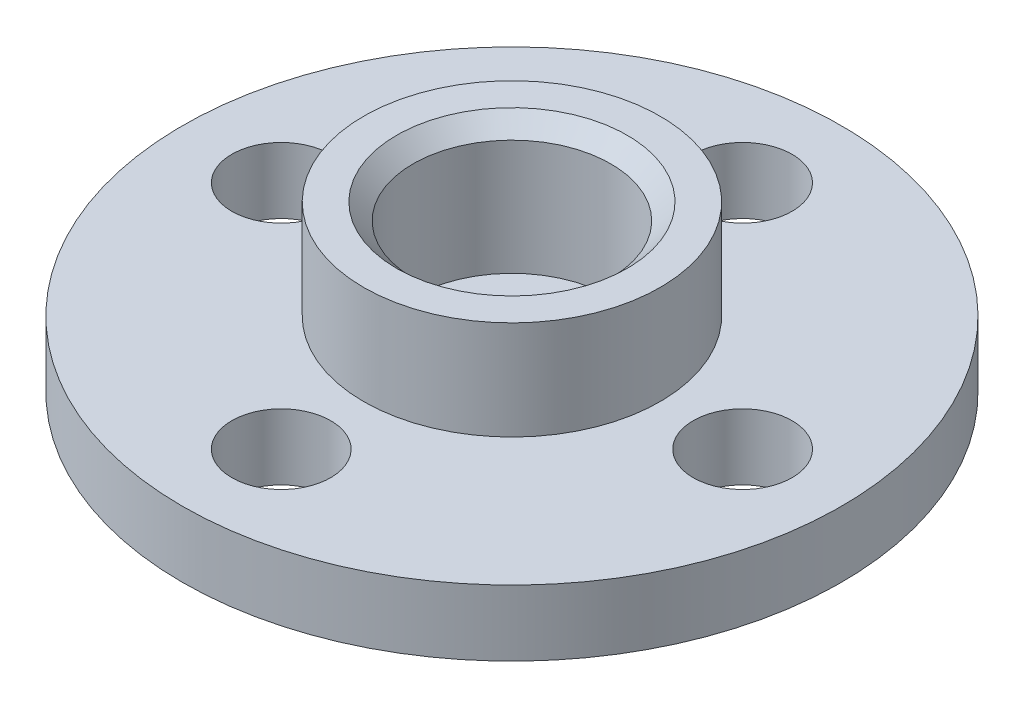
ISO-10303-21;
HEADER;
FILE_DESCRIPTION(('STEP AP214'),'2;1');
FILE_NAME('part.step','',(''),(''),'','','');
FILE_SCHEMA(('AUTOMOTIVE_DESIGN { 1 0 10303 214 1 1 1 1 }'));
ENDSEC;
DATA;
#1=APPLICATION_CONTEXT('core data for automotive mechanical design processes');
#2=APPLICATION_PROTOCOL_DEFINITION('international standard','automotive_design',2000,#1);
#3=PRODUCT_CONTEXT('',#1,'mechanical');
#4=PRODUCT('Part','Part','',(#3));
#5=PRODUCT_RELATED_PRODUCT_CATEGORY('part','',(#4));
#6=PRODUCT_DEFINITION_FORMATION('','',#4);
#7=PRODUCT_DEFINITION_CONTEXT('part definition',#1,'design');
#8=PRODUCT_DEFINITION('design','',#6,#7);
#9=PRODUCT_DEFINITION_SHAPE('','',#8);
#10=(LENGTH_UNIT() NAMED_UNIT(*) SI_UNIT(.MILLI.,.METRE.));
#11=(NAMED_UNIT(*) PLANE_ANGLE_UNIT() SI_UNIT($,.RADIAN.));
#12=(NAMED_UNIT(*) SI_UNIT($,.STERADIAN.) SOLID_ANGLE_UNIT());
#13=UNCERTAINTY_MEASURE_WITH_UNIT(LENGTH_MEASURE(1.E-05),#10,'distance_accuracy_value','');
#14=(GEOMETRIC_REPRESENTATION_CONTEXT(3) GLOBAL_UNCERTAINTY_ASSIGNED_CONTEXT((#13)) GLOBAL_UNIT_ASSIGNED_CONTEXT((#10,
#11,#12)) REPRESENTATION_CONTEXT('',''));
#15=CARTESIAN_POINT('',(0.,0.,0.));
#16=DIRECTION('',(0.,0.,1.));
#17=DIRECTION('',(1.,0.,0.));
#18=AXIS2_PLACEMENT_3D('',#15,#16,#17);
#19=CARTESIAN_POINT('',(0.,2.,0.));
#20=DIRECTION('',(0.,-1.,0.));
#21=DIRECTION('',(0.,0.,-1.));
#22=AXIS2_PLACEMENT_3D('',#19,#20,#21);
#23=CYLINDRICAL_SURFACE('',#22,10.);
#24=CARTESIAN_POINT('',(0.,2.,0.));
#25=DIRECTION('',(0.,1.,0.));
#26=DIRECTION('',(0.,0.,1.));
#27=AXIS2_PLACEMENT_3D('',#24,#25,#26);
#28=CIRCLE('',#27,10.);
#29=CARTESIAN_POINT('',(0.,2.,10.));
#30=VERTEX_POINT('',#29);
#31=EDGE_CURVE('E48',#30,#30,#28,.T.);
#32=ORIENTED_EDGE('',*,*,#31,.F.);
#33=EDGE_LOOP('',(#32));
#34=FACE_BOUND('',#33,.T.);
#35=CARTESIAN_POINT('',(0.,0.,0.));
#36=DIRECTION('',(0.,1.,0.));
#37=DIRECTION('',(0.,0.,1.));
#38=AXIS2_PLACEMENT_3D('',#35,#36,#37);
#39=CIRCLE('',#38,10.);
#40=CARTESIAN_POINT('',(0.,0.,10.));
#41=VERTEX_POINT('',#40);
#42=EDGE_CURVE('E70',#41,#41,#39,.T.);
#43=ORIENTED_EDGE('',*,*,#42,.T.);
#44=EDGE_LOOP('',(#43));
#45=FACE_BOUND('',#44,.T.);
#46=ADVANCED_FACE('F33',(#34,#45),#23,.T.);
#47=CARTESIAN_POINT('',(0.,2.,0.));
#48=DIRECTION('',(0.,1.,0.));
#49=DIRECTION('',(0.,0.,1.));
#50=AXIS2_PLACEMENT_3D('',#47,#48,#49);
#51=PLANE('',#50);
#52=CARTESIAN_POINT('',(-7.,2.,0.));
#53=DIRECTION('',(0.,1.,0.));
#54=DIRECTION('',(0.,0.,1.));
#55=AXIS2_PLACEMENT_3D('',#52,#53,#54);
#56=CIRCLE('',#55,1.5);
#57=CARTESIAN_POINT('',(-7.,2.,1.5));
#58=VERTEX_POINT('',#57);
#59=EDGE_CURVE('E69',#58,#58,#56,.T.);
#60=ORIENTED_EDGE('',*,*,#59,.F.);
#61=EDGE_LOOP('',(#60));
#62=FACE_BOUND('',#61,.T.);
#63=CARTESIAN_POINT('',(0.,2.,-7.));
#64=DIRECTION('',(0.,1.,0.));
#65=DIRECTION('',(0.,0.,1.));
#66=AXIS2_PLACEMENT_3D('',#63,#64,#65);
#67=CIRCLE('',#66,1.5);
#68=CARTESIAN_POINT('',(0.,2.,-5.5));
#69=VERTEX_POINT('',#68);
#70=EDGE_CURVE('E83',#69,#69,#67,.T.);
#71=ORIENTED_EDGE('',*,*,#70,.F.);
#72=EDGE_LOOP('',(#71));
#73=FACE_BOUND('',#72,.T.);
#74=CARTESIAN_POINT('',(7.,2.,0.));
#75=DIRECTION('',(0.,1.,0.));
#76=DIRECTION('',(0.,0.,1.));
#77=AXIS2_PLACEMENT_3D('',#74,#75,#76);
#78=CIRCLE('',#77,1.5);
#79=CARTESIAN_POINT('',(7.,2.,1.50000000000005));
#80=VERTEX_POINT('',#79);
#81=EDGE_CURVE('E80',#80,#80,#78,.T.);
#82=ORIENTED_EDGE('',*,*,#81,.F.);
#83=EDGE_LOOP('',(#82));
#84=FACE_BOUND('',#83,.T.);
#85=CARTESIAN_POINT('',(0.,2.,7.));
#86=DIRECTION('',(0.,1.,0.));
#87=DIRECTION('',(0.,0.,1.));
#88=AXIS2_PLACEMENT_3D('',#85,#86,#87);
#89=CIRCLE('',#88,1.5);
#90=CARTESIAN_POINT('',(0.,2.,8.5));
#91=VERTEX_POINT('',#90);
#92=EDGE_CURVE('E77',#91,#91,#89,.T.);
#93=ORIENTED_EDGE('',*,*,#92,.F.);
#94=EDGE_LOOP('',(#93));
#95=FACE_BOUND('',#94,.T.);
#96=CARTESIAN_POINT('',(0.,2.,0.));
#97=DIRECTION('',(0.,1.,0.));
#98=DIRECTION('',(0.,0.,1.));
#99=AXIS2_PLACEMENT_3D('',#96,#97,#98);
#100=CIRCLE('',#99,4.5);
#101=CARTESIAN_POINT('',(0.,2.,4.5));
#102=VERTEX_POINT('',#101);
#103=EDGE_CURVE('E44',#102,#102,#100,.T.);
#104=ORIENTED_EDGE('',*,*,#103,.F.);
#105=EDGE_LOOP('',(#104));
#106=FACE_BOUND('',#105,.T.);
#107=ORIENTED_EDGE('',*,*,#31,.T.);
#108=EDGE_LOOP('',(#107));
#109=FACE_BOUND('',#108,.T.);
#110=ADVANCED_FACE('F113',(#62,#73,#84,#95,#106,#109),#51,.T.);
#111=CARTESIAN_POINT('',(0.,0.,0.));
#112=DIRECTION('',(0.,1.,0.));
#113=DIRECTION('',(0.,0.,1.));
#114=AXIS2_PLACEMENT_3D('',#111,#112,#113);
#115=PLANE('',#114);
#116=CARTESIAN_POINT('',(0.,0.,0.));
#117=DIRECTION('',(0.,1.,0.));
#118=DIRECTION('',(0.,0.,1.));
#119=AXIS2_PLACEMENT_3D('',#116,#117,#118);
#120=CIRCLE('',#119,1.5);
#121=CARTESIAN_POINT('',(0.,0.,1.5));
#122=VERTEX_POINT('',#121);
#123=EDGE_CURVE('E51',#122,#122,#120,.T.);
#124=ORIENTED_EDGE('',*,*,#123,.T.);
#125=EDGE_LOOP('',(#124));
#126=FACE_BOUND('',#125,.T.);
#127=CARTESIAN_POINT('',(-7.,0.,0.));
#128=DIRECTION('',(0.,1.,0.));
#129=DIRECTION('',(0.,0.,1.));
#130=AXIS2_PLACEMENT_3D('',#127,#128,#129);
#131=CIRCLE('',#130,1.5);
#132=CARTESIAN_POINT('',(-7.,0.,1.5));
#133=VERTEX_POINT('',#132);
#134=EDGE_CURVE('E56',#133,#133,#131,.T.);
#135=ORIENTED_EDGE('',*,*,#134,.T.);
#136=EDGE_LOOP('',(#135));
#137=FACE_BOUND('',#136,.T.);
#138=CARTESIAN_POINT('',(0.,0.,-7.));
#139=DIRECTION('',(0.,1.,0.));
#140=DIRECTION('',(0.,0.,1.));
#141=AXIS2_PLACEMENT_3D('',#138,#139,#140);
#142=CIRCLE('',#141,1.5);
#143=CARTESIAN_POINT('',(0.,0.,-5.5));
#144=VERTEX_POINT('',#143);
#145=EDGE_CURVE('E60',#144,#144,#142,.T.);
#146=ORIENTED_EDGE('',*,*,#145,.T.);
#147=EDGE_LOOP('',(#146));
#148=FACE_BOUND('',#147,.T.);
#149=CARTESIAN_POINT('',(7.,0.,0.));
#150=DIRECTION('',(0.,1.,0.));
#151=DIRECTION('',(0.,0.,1.));
#152=AXIS2_PLACEMENT_3D('',#149,#150,#151);
#153=CIRCLE('',#152,1.5);
#154=CARTESIAN_POINT('',(7.,0.,1.50000000000005));
#155=VERTEX_POINT('',#154);
#156=EDGE_CURVE('E63',#155,#155,#153,.T.);
#157=ORIENTED_EDGE('',*,*,#156,.T.);
#158=EDGE_LOOP('',(#157));
#159=FACE_BOUND('',#158,.T.);
#160=CARTESIAN_POINT('',(0.,0.,7.));
#161=DIRECTION('',(0.,1.,0.));
#162=DIRECTION('',(0.,0.,1.));
#163=AXIS2_PLACEMENT_3D('',#160,#161,#162);
#164=CIRCLE('',#163,1.5);
#165=CARTESIAN_POINT('',(0.,0.,8.5));
#166=VERTEX_POINT('',#165);
#167=EDGE_CURVE('E66',#166,#166,#164,.T.);
#168=ORIENTED_EDGE('',*,*,#167,.T.);
#169=EDGE_LOOP('',(#168));
#170=FACE_BOUND('',#169,.T.);
#171=ORIENTED_EDGE('',*,*,#42,.F.);
#172=EDGE_LOOP('',(#171));
#173=FACE_BOUND('',#172,.T.);
#174=ADVANCED_FACE('F118',(#126,#137,#148,#159,#170,#173),#115,.F.);
#175=CARTESIAN_POINT('',(0.,5.,0.));
#176=DIRECTION('',(0.,-1.,0.));
#177=DIRECTION('',(0.,0.,-1.));
#178=AXIS2_PLACEMENT_3D('',#175,#176,#177);
#179=CYLINDRICAL_SURFACE('',#178,4.5);
#180=CARTESIAN_POINT('',(0.,5.,0.));
#181=DIRECTION('',(0.,1.,0.));
#182=DIRECTION('',(0.,0.,1.));
#183=AXIS2_PLACEMENT_3D('',#180,#181,#182);
#184=CIRCLE('',#183,4.5);
#185=CARTESIAN_POINT('',(0.,5.,4.5));
#186=VERTEX_POINT('',#185);
#187=EDGE_CURVE('E59',#186,#186,#184,.T.);
#188=ORIENTED_EDGE('',*,*,#187,.F.);
#189=EDGE_LOOP('',(#188));
#190=FACE_BOUND('',#189,.T.);
#191=ORIENTED_EDGE('',*,*,#103,.T.);
#192=EDGE_LOOP('',(#191));
#193=FACE_BOUND('',#192,.T.);
#194=ADVANCED_FACE('F125',(#190,#193),#179,.T.);
#195=CARTESIAN_POINT('',(0.,5.,0.));
#196=DIRECTION('',(0.,1.,0.));
#197=DIRECTION('',(0.,0.,1.));
#198=AXIS2_PLACEMENT_3D('',#195,#196,#197);
#199=PLANE('',#198);
#200=CARTESIAN_POINT('',(0.,5.,0.));
#201=DIRECTION('',(0.,1.,0.));
#202=DIRECTION('',(0.,0.,1.));
#203=AXIS2_PLACEMENT_3D('',#200,#201,#202);
#204=CIRCLE('',#203,3.50000000000001);
#205=CARTESIAN_POINT('',(0.,5.,3.50000000000001));
#206=VERTEX_POINT('',#205);
#207=EDGE_CURVE('E10',#206,#206,#204,.F.);
#208=ORIENTED_EDGE('',*,*,#207,.T.);
#209=EDGE_LOOP('',(#208));
#210=FACE_BOUND('',#209,.T.);
#211=ORIENTED_EDGE('',*,*,#187,.T.);
#212=EDGE_LOOP('',(#211));
#213=FACE_BOUND('',#212,.T.);
#214=ADVANCED_FACE('F130',(#210,#213),#199,.T.);
#215=CARTESIAN_POINT('',(0.,-1.,7.));
#216=DIRECTION('',(0.,1.,0.));
#217=DIRECTION('',(0.,0.,1.));
#218=AXIS2_PLACEMENT_3D('',#215,#216,#217);
#219=CYLINDRICAL_SURFACE('',#218,1.5);
#220=ORIENTED_EDGE('',*,*,#92,.T.);
#221=EDGE_LOOP('',(#220));
#222=FACE_BOUND('',#221,.T.);
#223=ORIENTED_EDGE('',*,*,#167,.F.);
#224=EDGE_LOOP('',(#223));
#225=FACE_BOUND('',#224,.T.);
#226=ADVANCED_FACE('F134',(#222,#225),#219,.F.);
#227=CARTESIAN_POINT('',(7.,-1.,0.));
#228=DIRECTION('',(0.,1.,0.));
#229=DIRECTION('',(0.,0.,1.));
#230=AXIS2_PLACEMENT_3D('',#227,#228,#229);
#231=CYLINDRICAL_SURFACE('',#230,1.5);
#232=ORIENTED_EDGE('',*,*,#81,.T.);
#233=EDGE_LOOP('',(#232));
#234=FACE_BOUND('',#233,.T.);
#235=ORIENTED_EDGE('',*,*,#156,.F.);
#236=EDGE_LOOP('',(#235));
#237=FACE_BOUND('',#236,.T.);
#238=ADVANCED_FACE('F137',(#234,#237),#231,.F.);
#239=CARTESIAN_POINT('',(0.,-1.,-7.));
#240=DIRECTION('',(0.,1.,0.));
#241=DIRECTION('',(0.,0.,1.));
#242=AXIS2_PLACEMENT_3D('',#239,#240,#241);
#243=CYLINDRICAL_SURFACE('',#242,1.5);
#244=ORIENTED_EDGE('',*,*,#70,.T.);
#245=EDGE_LOOP('',(#244));
#246=FACE_BOUND('',#245,.T.);
#247=ORIENTED_EDGE('',*,*,#145,.F.);
#248=EDGE_LOOP('',(#247));
#249=FACE_BOUND('',#248,.T.);
#250=ADVANCED_FACE('F109',(#246,#249),#243,.F.);
#251=CARTESIAN_POINT('',(-7.,-1.,0.));
#252=DIRECTION('',(0.,1.,0.));
#253=DIRECTION('',(0.,0.,1.));
#254=AXIS2_PLACEMENT_3D('',#251,#252,#253);
#255=CYLINDRICAL_SURFACE('',#254,1.5);
#256=ORIENTED_EDGE('',*,*,#59,.T.);
#257=EDGE_LOOP('',(#256));
#258=FACE_BOUND('',#257,.T.);
#259=ORIENTED_EDGE('',*,*,#134,.F.);
#260=EDGE_LOOP('',(#259));
#261=FACE_BOUND('',#260,.T.);
#262=ADVANCED_FACE('F104',(#258,#261),#255,.F.);
#263=CARTESIAN_POINT('',(0.,1.,0.));
#264=DIRECTION('',(0.,1.,0.));
#265=DIRECTION('',(0.,0.,1.));
#266=AXIS2_PLACEMENT_3D('',#263,#264,#265);
#267=CYLINDRICAL_SURFACE('',#266,3.);
#268=CARTESIAN_POINT('',(0.,4.49999999999999,0.));
#269=DIRECTION('',(0.,1.,0.));
#270=DIRECTION('',(0.,0.,1.));
#271=AXIS2_PLACEMENT_3D('',#268,#269,#270);
#272=CIRCLE('',#271,3.);
#273=CARTESIAN_POINT('',(0.,4.49999999999999,3.));
#274=VERTEX_POINT('',#273);
#275=EDGE_CURVE('E40',#274,#274,#272,.T.);
#276=ORIENTED_EDGE('',*,*,#275,.T.);
#277=EDGE_LOOP('',(#276));
#278=FACE_BOUND('',#277,.T.);
#279=CARTESIAN_POINT('',(0.,1.,0.));
#280=DIRECTION('',(0.,1.,0.));
#281=DIRECTION('',(0.,0.,1.));
#282=AXIS2_PLACEMENT_3D('',#279,#280,#281);
#283=CIRCLE('',#282,3.);
#284=CARTESIAN_POINT('',(0.,1.,3.));
#285=VERTEX_POINT('',#284);
#286=EDGE_CURVE('E54',#285,#285,#283,.T.);
#287=ORIENTED_EDGE('',*,*,#286,.F.);
#288=EDGE_LOOP('',(#287));
#289=FACE_BOUND('',#288,.T.);
#290=ADVANCED_FACE('F99',(#278,#289),#267,.F.);
#291=CARTESIAN_POINT('',(0.,1.,0.));
#292=DIRECTION('',(0.,1.,0.));
#293=DIRECTION('',(0.,0.,1.));
#294=AXIS2_PLACEMENT_3D('',#291,#292,#293);
#295=PLANE('',#294);
#296=CARTESIAN_POINT('',(0.,1.,0.));
#297=DIRECTION('',(0.,1.,0.));
#298=DIRECTION('',(0.,0.,1.));
#299=AXIS2_PLACEMENT_3D('',#296,#297,#298);
#300=CIRCLE('',#299,1.5);
#301=CARTESIAN_POINT('',(0.,1.,1.5));
#302=VERTEX_POINT('',#301);
#303=EDGE_CURVE('E55',#302,#302,#300,.T.);
#304=ORIENTED_EDGE('',*,*,#303,.F.);
#305=EDGE_LOOP('',(#304));
#306=FACE_BOUND('',#305,.T.);
#307=ORIENTED_EDGE('',*,*,#286,.T.);
#308=EDGE_LOOP('',(#307));
#309=FACE_BOUND('',#308,.T.);
#310=ADVANCED_FACE('F96',(#306,#309),#295,.T.);
#311=CARTESIAN_POINT('',(0.,-3.,0.));
#312=DIRECTION('',(0.,1.,0.));
#313=DIRECTION('',(0.,0.,1.));
#314=AXIS2_PLACEMENT_3D('',#311,#312,#313);
#315=CYLINDRICAL_SURFACE('',#314,1.5);
#316=ORIENTED_EDGE('',*,*,#303,.T.);
#317=EDGE_LOOP('',(#316));
#318=FACE_BOUND('',#317,.T.);
#319=ORIENTED_EDGE('',*,*,#123,.F.);
#320=EDGE_LOOP('',(#319));
#321=FACE_BOUND('',#320,.T.);
#322=ADVANCED_FACE('F93',(#318,#321),#315,.F.);
#323=CARTESIAN_POINT('',(0.,4.49999999999999,0.));
#324=DIRECTION('',(0.,1.,0.));
#325=DIRECTION('',(0.,0.,1.));
#326=AXIS2_PLACEMENT_3D('',#323,#324,#325);
#327=CONICAL_SURFACE('',#326,3.,0.785398163397448);
#328=ORIENTED_EDGE('',*,*,#207,.F.);
#329=EDGE_LOOP('',(#328));
#330=FACE_BOUND('',#329,.T.);
#331=ORIENTED_EDGE('',*,*,#275,.F.);
#332=EDGE_LOOP('',(#331));
#333=FACE_BOUND('',#332,.T.);
#334=ADVANCED_FACE('F35',(#330,#333),#327,.F.);
#335=CLOSED_SHELL('',(#46,#110,#174,#194,#214,#226,#238,#250,#262,#290,#310,#322,#334));
#336=MANIFOLD_SOLID_BREP('B2',#335);
#337=ADVANCED_BREP_SHAPE_REPRESENTATION('',(#18,#336),#14);
#338=SHAPE_DEFINITION_REPRESENTATION(#9,#337);
ENDSEC;
END-ISO-10303-21;
